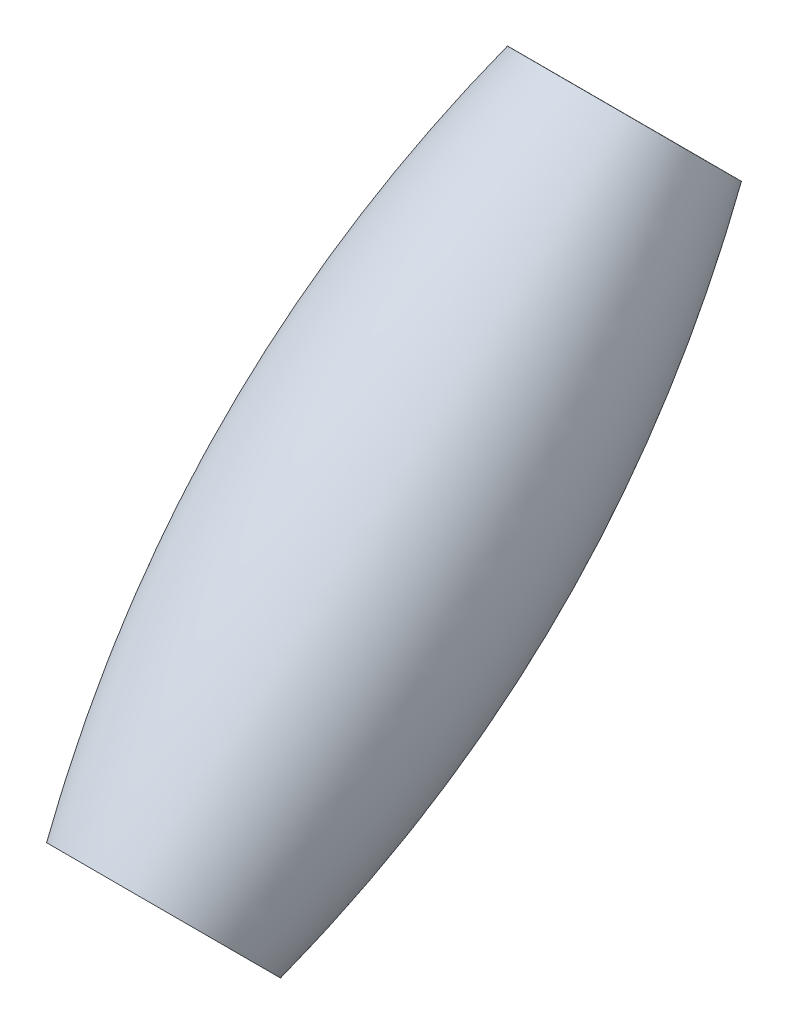
ISO-10303-21;
HEADER;
FILE_DESCRIPTION(('STEP AP214'),'2;1');
FILE_NAME('part.step','',(''),(''),'','','');
FILE_SCHEMA(('AUTOMOTIVE_DESIGN { 1 0 10303 214 1 1 1 1 }'));
ENDSEC;
DATA;
#1=APPLICATION_CONTEXT('core data for automotive mechanical design processes');
#2=APPLICATION_PROTOCOL_DEFINITION('international standard','automotive_design',2000,#1);
#3=PRODUCT_CONTEXT('',#1,'mechanical');
#4=PRODUCT('Part','Part','',(#3));
#5=PRODUCT_RELATED_PRODUCT_CATEGORY('part','',(#4));
#6=PRODUCT_DEFINITION_FORMATION('','',#4);
#7=PRODUCT_DEFINITION_CONTEXT('part definition',#1,'design');
#8=PRODUCT_DEFINITION('design','',#6,#7);
#9=PRODUCT_DEFINITION_SHAPE('','',#8);
#10=(LENGTH_UNIT() NAMED_UNIT(*) SI_UNIT(.MILLI.,.METRE.));
#11=(NAMED_UNIT(*) PLANE_ANGLE_UNIT() SI_UNIT($,.RADIAN.));
#12=(NAMED_UNIT(*) SI_UNIT($,.STERADIAN.) SOLID_ANGLE_UNIT());
#13=UNCERTAINTY_MEASURE_WITH_UNIT(LENGTH_MEASURE(1.E-05),#10,'distance_accuracy_value','');
#14=(GEOMETRIC_REPRESENTATION_CONTEXT(3) GLOBAL_UNCERTAINTY_ASSIGNED_CONTEXT((#13)) GLOBAL_UNIT_ASSIGNED_CONTEXT((#10,
#11,#12)) REPRESENTATION_CONTEXT('',''));
#15=CARTESIAN_POINT('',(0.,0.,0.));
#16=DIRECTION('',(0.,0.,1.));
#17=DIRECTION('',(1.,0.,0.));
#18=AXIS2_PLACEMENT_3D('',#15,#16,#17);
#19=CARTESIAN_POINT('',(56.11753993723,-1.401400444374,-12.55408754298));
#20=CARTESIAN_POINT('',(56.13259592546,-1.484652197579,-12.41813539534));
#21=CARTESIAN_POINT('',(56.90910734763,-5.833603400682,-5.350878623048));
#22=CARTESIAN_POINT('',(57.66217184059,-15.80656928184,7.288192001957));
#23=CARTESIAN_POINT('',(56.87527783727,-28.44464568726,17.26010750185));
#24=CARTESIAN_POINT('',(56.08166500522,-35.51091086095,21.60796052362));
#25=CARTESIAN_POINT('',(56.06626245156,-35.64700329285,21.69128816117));
#26=B_SPLINE_CURVE_WITH_KNOTS('',3,(#19,#20,#21,#22,#23,#24,#25),.UNSPECIFIED.,.F.,.F.,(4,1,1,1,
4),(0.,0.009600436894524,0.499994266707,0.9903880965195,1.),.UNSPECIFIED.);
#27=CARTESIAN_POINT('',(53.47223947539,-41.48281690256,18.5520191789));
#28=DIRECTION('',(0.00105765973001379,0.707106781180908,-0.707105990190912));
#29=AXIS1_PLACEMENT('',#27,#28);
#30=SURFACE_OF_REVOLUTION('',#26,#29);
#31=CARTESIAN_POINT('',(53.4747514172487,-39.80343829729,16.8726424522313));
#32=DIRECTION('',(0.00105765973001379,0.707106781180908,-0.707105990190912));
#33=DIRECTION('',(0.,0.707106385691218,0.707107176681656));
#34=AXIS2_PLACEMENT_3D('',#31,#32,#33);
#35=CIRCLE('',#34,6.97500000001659);
#36=CARTESIAN_POINT('',(53.4747514172487,-34.8713712570821,21.8047150095976));
#37=VERTEX_POINT('',#36);
#38=EDGE_CURVE('E45',#37,#37,#35,.T.);
#39=ORIENTED_EDGE('',*,*,#38,.T.);
#40=EDGE_LOOP('',(#39));
#41=FACE_BOUND('',#40,.T.);
#42=CARTESIAN_POINT('',(53.5249902544245,-6.21586619112422,-16.7148920819097));
#43=DIRECTION('',(0.00105765973001379,0.707106781180908,-0.707105990190912));
#44=DIRECTION('',(0.,0.707106385691218,0.707107176681656));
#45=AXIS2_PLACEMENT_3D('',#42,#43,#44);
#46=CIRCLE('',#45,6.97500000033333);
#47=CARTESIAN_POINT('',(53.5249902544245,-1.28379915069227,-11.7828195243195));
#48=VERTEX_POINT('',#47);
#49=EDGE_CURVE('E19',#48,#48,#46,.T.);
#50=ORIENTED_EDGE('',*,*,#49,.F.);
#51=EDGE_LOOP('',(#50));
#52=FACE_BOUND('',#51,.T.);
#53=ADVANCED_FACE('F15',(#41,#52),#30,.F.);
#54=CARTESIAN_POINT('',(62.99159655358,-3.416229699845,-13.90109270279));
#55=DIRECTION('',(0.00105765972991925,0.707106781186645,-0.707105990185175));
#56=DIRECTION('',(-0.378104557586729,-0.654330019278466,-0.654896304313275));
#57=AXIS2_PLACEMENT_3D('',#54,#55,#56);
#58=PLANE('',#57);
#59=CARTESIAN_POINT('',(53.5249902544245,-6.21586619113983,-16.7148920818941));
#60=DIRECTION('',(0.00105765973001394,0.707106781180908,-0.707105990190912));
#61=DIRECTION('',(0.,0.707106385691218,0.707107176681656));
#62=AXIS2_PLACEMENT_3D('',#59,#60,#61);
#63=CIRCLE('',#62,4.49999999964899);
#64=CARTESIAN_POINT('',(53.5249902544245,-3.03388745577756,-13.5329097870749));
#65=VERTEX_POINT('',#64);
#66=EDGE_CURVE('E43',#65,#65,#63,.T.);
#67=ORIENTED_EDGE('',*,*,#66,.F.);
#68=EDGE_LOOP('',(#67));
#69=FACE_BOUND('',#68,.T.);
#70=ORIENTED_EDGE('',*,*,#49,.T.);
#71=EDGE_LOOP('',(#70));
#72=FACE_BOUND('',#71,.T.);
#73=ADVANCED_FACE('F52',(#69,#72),#58,.T.);
#74=CARTESIAN_POINT('',(62.94135771643,-37.00380180621,19.686441831));
#75=DIRECTION('',(0.00105765972944008,0.707106781186598,-0.707105990185224));
#76=DIRECTION('',(-0.378104557586644,-0.654330019278664,-0.654896304313127));
#77=AXIS2_PLACEMENT_3D('',#74,#75,#76);
#78=PLANE('',#77);
#79=CARTESIAN_POINT('',(53.4747514172488,-39.8034382972327,16.8726424521739));
#80=DIRECTION('',(0.00105765973001533,0.70710678118091,-0.707105990190911));
#81=DIRECTION('',(0.,0.707106385691217,0.707107176681657));
#82=AXIS2_PLACEMENT_3D('',#79,#80,#81);
#83=CIRCLE('',#82,4.49999999997762);
#84=CARTESIAN_POINT('',(53.4747514172488,-36.621459561638,20.0546247472255));
#85=VERTEX_POINT('',#84);
#86=EDGE_CURVE('E40',#85,#85,#83,.F.);
#87=ORIENTED_EDGE('',*,*,#86,.F.);
#88=EDGE_LOOP('',(#87));
#89=FACE_BOUND('',#88,.T.);
#90=ORIENTED_EDGE('',*,*,#38,.F.);
#91=EDGE_LOOP('',(#90));
#92=FACE_BOUND('',#91,.T.);
#93=ADVANCED_FACE('F60',(#89,#92),#78,.F.);
#94=CARTESIAN_POINT('',(53.5206538495314,-9.1150039939798,-13.8157575221131));
#95=DIRECTION('',(0.00105765973001394,0.707106781180908,-0.707105990190912));
#96=DIRECTION('',(0.,0.707106385691218,0.707107176681656));
#97=AXIS2_PLACEMENT_3D('',#94,#95,#96);
#98=CYLINDRICAL_SURFACE('',#97,4.49999999964899);
#99=CARTESIAN_POINT('',(53.5206538495314,-9.1150039939798,-13.8157575221131));
#100=DIRECTION('',(0.00105765973001394,0.707106781180908,-0.707105990190912));
#101=DIRECTION('',(0.,0.707106385691218,0.707107176681656));
#102=AXIS2_PLACEMENT_3D('',#99,#100,#101);
#103=CIRCLE('',#102,4.49999999964899);
#104=CARTESIAN_POINT('',(53.5206538495314,-5.93302525861752,-10.6337752272939));
#105=VERTEX_POINT('',#104);
#106=EDGE_CURVE('E37',#105,#105,#103,.T.);
#107=ORIENTED_EDGE('',*,*,#106,.F.);
#108=EDGE_LOOP('',(#107));
#109=FACE_BOUND('',#108,.T.);
#110=ORIENTED_EDGE('',*,*,#66,.T.);
#111=EDGE_LOOP('',(#110));
#112=FACE_BOUND('',#111,.T.);
#113=ADVANCED_FACE('F76',(#109,#112),#98,.F.);
#114=CARTESIAN_POINT('',(53.4747514172488,-39.8034382972327,16.8726424521739));
#115=DIRECTION('',(0.00105765973001533,0.70710678118091,-0.707105990190911));
#116=DIRECTION('',(0.,0.707106385691217,0.707107176681657));
#117=AXIS2_PLACEMENT_3D('',#114,#115,#116);
#118=CYLINDRICAL_SURFACE('',#117,4.49999999997762);
#119=CARTESIAN_POINT('',(53.4790878221419,-36.9043004943908,13.973507892391));
#120=DIRECTION('',(0.00105765973001533,0.70710678118091,-0.707105990190911));
#121=DIRECTION('',(0.,0.707106385691217,0.707107176681657));
#122=AXIS2_PLACEMENT_3D('',#119,#120,#121);
#123=CIRCLE('',#122,4.49999999997762);
#124=CARTESIAN_POINT('',(53.4790878221419,-33.7223217587961,17.1554901874426));
#125=VERTEX_POINT('',#124);
#126=EDGE_CURVE('E28',#125,#125,#123,.T.);
#127=ORIENTED_EDGE('',*,*,#126,.T.);
#128=EDGE_LOOP('',(#127));
#129=FACE_BOUND('',#128,.T.);
#130=ORIENTED_EDGE('',*,*,#86,.T.);
#131=EDGE_LOOP('',(#130));
#132=FACE_BOUND('',#131,.T.);
#133=ADVANCED_FACE('F74',(#129,#132),#118,.F.);
#134=CARTESIAN_POINT('',(59.62961791856,-7.309214314484,-12.00082828817));
#135=DIRECTION('',(0.00105765972927002,0.707106781186729,-0.707105990185093));
#136=DIRECTION('',(-0.378104557586638,-0.654330019278589,-0.654896304313204));
#137=AXIS2_PLACEMENT_3D('',#134,#135,#136);
#138=PLANE('',#137);
#139=CARTESIAN_POINT('',(53.5206538495315,-9.11500399399169,-13.8157575221011));
#140=DIRECTION('',(0.00105765973001643,0.707106781180911,-0.70710599019091));
#141=DIRECTION('',(0.,0.707106385691216,0.707107176681658));
#142=AXIS2_PLACEMENT_3D('',#139,#140,#141);
#143=CIRCLE('',#142,2.49999999981537);
#144=CARTESIAN_POINT('',(53.5206538495315,-7.34723802989421,-12.0479895805275));
#145=VERTEX_POINT('',#144);
#146=EDGE_CURVE('E23',#145,#145,#143,.T.);
#147=ORIENTED_EDGE('',*,*,#146,.F.);
#148=EDGE_LOOP('',(#147));
#149=FACE_BOUND('',#148,.T.);
#150=ORIENTED_EDGE('',*,*,#106,.T.);
#151=EDGE_LOOP('',(#150));
#152=FACE_BOUND('',#151,.T.);
#153=ADVANCED_FACE('F71',(#149,#152),#138,.T.);
#154=CARTESIAN_POINT('',(59.58805189119,-35.09851081512,15.78843712611));
#155=DIRECTION('',(0.00105765972904392,0.707106781186622,-0.7071059901852));
#156=DIRECTION('',(-0.378104557586506,-0.654330019278787,-0.654896304313083));
#157=AXIS2_PLACEMENT_3D('',#154,#155,#156);
#158=PLANE('',#157);
#159=CARTESIAN_POINT('',(53.4790878221419,-36.904300494401,13.9735078924013));
#160=DIRECTION('',(0.00105765973001643,0.707106781180911,-0.70710599019091));
#161=DIRECTION('',(0.,0.707106385691216,0.707107176681658));
#162=AXIS2_PLACEMENT_3D('',#159,#160,#161);
#163=CIRCLE('',#162,2.49999999981537);
#164=CARTESIAN_POINT('',(53.4790878221419,-35.1365345303036,15.7412758339749));
#165=VERTEX_POINT('',#164);
#166=EDGE_CURVE('E10',#165,#165,#163,.F.);
#167=ORIENTED_EDGE('',*,*,#166,.F.);
#168=EDGE_LOOP('',(#167));
#169=FACE_BOUND('',#168,.T.);
#170=ORIENTED_EDGE('',*,*,#126,.F.);
#171=EDGE_LOOP('',(#170));
#172=FACE_BOUND('',#171,.T.);
#173=ADVANCED_FACE('F17',(#169,#172),#158,.F.);
#174=CARTESIAN_POINT('',(53.4790878221419,-36.904300494401,13.9735078924013));
#175=DIRECTION('',(0.00105765973001643,0.707106781180911,-0.70710599019091));
#176=DIRECTION('',(0.,0.707106385691216,0.707107176681658));
#177=AXIS2_PLACEMENT_3D('',#174,#175,#176);
#178=CYLINDRICAL_SURFACE('',#177,2.49999999981537);
#179=ORIENTED_EDGE('',*,*,#146,.T.);
#180=EDGE_LOOP('',(#179));
#181=FACE_BOUND('',#180,.T.);
#182=ORIENTED_EDGE('',*,*,#166,.T.);
#183=EDGE_LOOP('',(#182));
#184=FACE_BOUND('',#183,.T.);
#185=ADVANCED_FACE('F64',(#181,#184),#178,.F.);
#186=CLOSED_SHELL('',(#53,#73,#93,#113,#133,#153,#173,#185));
#187=MANIFOLD_SOLID_BREP('B1',#186);
#188=ADVANCED_BREP_SHAPE_REPRESENTATION('',(#18,#187),#14);
#189=SHAPE_DEFINITION_REPRESENTATION(#9,#188);
ENDSEC;
END-ISO-10303-21;
